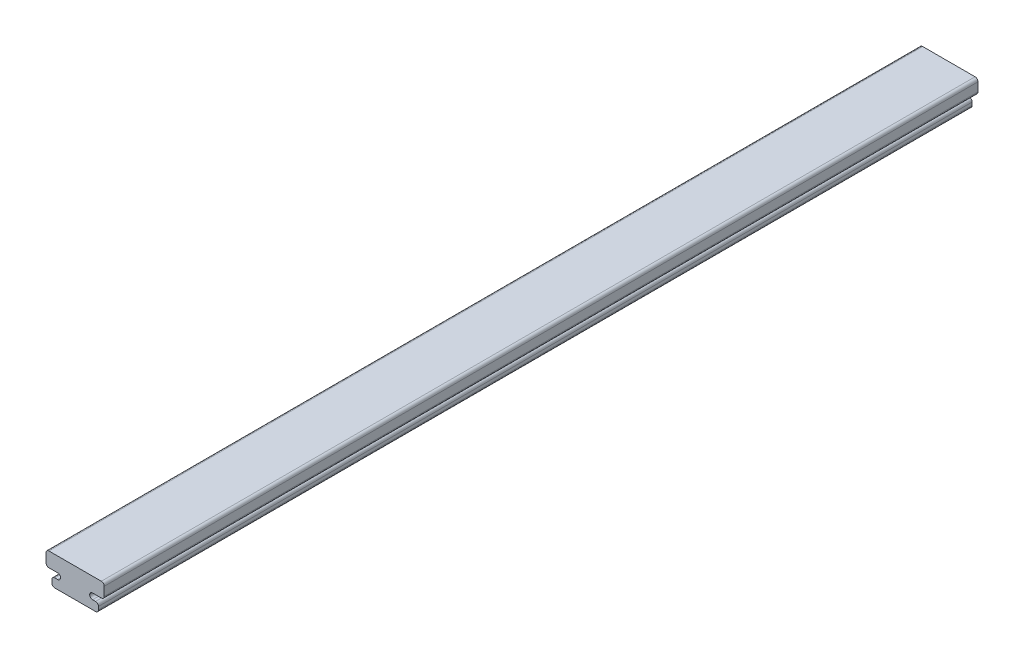
ISO-10303-21;
HEADER;
FILE_DESCRIPTION(('STEP AP214'),'2;1');
FILE_NAME('part.step','',(''),(''),'','','');
FILE_SCHEMA(('AUTOMOTIVE_DESIGN { 1 0 10303 214 1 1 1 1 }'));
ENDSEC;
DATA;
#1=APPLICATION_CONTEXT('core data for automotive mechanical design processes');
#2=APPLICATION_PROTOCOL_DEFINITION('international standard','automotive_design',2000,#1);
#3=PRODUCT_CONTEXT('',#1,'mechanical');
#4=PRODUCT('Part','Part','',(#3));
#5=PRODUCT_RELATED_PRODUCT_CATEGORY('part','',(#4));
#6=PRODUCT_DEFINITION_FORMATION('','',#4);
#7=PRODUCT_DEFINITION_CONTEXT('part definition',#1,'design');
#8=PRODUCT_DEFINITION('design','',#6,#7);
#9=PRODUCT_DEFINITION_SHAPE('','',#8);
#10=(LENGTH_UNIT() NAMED_UNIT(*) SI_UNIT(.MILLI.,.METRE.));
#11=(NAMED_UNIT(*) PLANE_ANGLE_UNIT() SI_UNIT($,.RADIAN.));
#12=(NAMED_UNIT(*) SI_UNIT($,.STERADIAN.) SOLID_ANGLE_UNIT());
#13=UNCERTAINTY_MEASURE_WITH_UNIT(LENGTH_MEASURE(1.E-05),#10,'distance_accuracy_value','');
#14=(GEOMETRIC_REPRESENTATION_CONTEXT(3) GLOBAL_UNCERTAINTY_ASSIGNED_CONTEXT((#13)) GLOBAL_UNIT_ASSIGNED_CONTEXT((#10,
#11,#12)) REPRESENTATION_CONTEXT('',''));
#15=CARTESIAN_POINT('',(0.,0.,0.));
#16=DIRECTION('',(0.,0.,1.));
#17=DIRECTION('',(1.,0.,0.));
#18=AXIS2_PLACEMENT_3D('',#15,#16,#17);
#19=CARTESIAN_POINT('',(0.,0.,300.));
#20=DIRECTION('',(-1.,0.,0.));
#21=DIRECTION('',(0.,0.,1.));
#22=AXIS2_PLACEMENT_3D('',#19,#20,#21);
#23=PLANE('',#22);
#24=DIRECTION('',(0.,1.,0.));
#25=VECTOR('',#24,1.);
#26=CARTESIAN_POINT('',(0.,0.,300.));
#27=LINE('',#26,#25);
#28=CARTESIAN_POINT('',(0.,1.,300.));
#29=VERTEX_POINT('',#28);
#30=CARTESIAN_POINT('',(0.,2.,300.));
#31=VERTEX_POINT('',#30);
#32=EDGE_CURVE('E225',#29,#31,#27,.T.);
#33=ORIENTED_EDGE('',*,*,#32,.F.);
#34=DIRECTION('',(0.,0.,-1.));
#35=VECTOR('',#34,1.);
#36=CARTESIAN_POINT('',(0.,1.,300.));
#37=LINE('',#36,#35);
#38=CARTESIAN_POINT('',(0.,1.,0.));
#39=VERTEX_POINT('',#38);
#40=EDGE_CURVE('E244',#29,#39,#37,.T.);
#41=ORIENTED_EDGE('',*,*,#40,.T.);
#42=DIRECTION('',(0.,1.,0.));
#43=VECTOR('',#42,1.);
#44=CARTESIAN_POINT('',(0.,0.,0.));
#45=LINE('',#44,#43);
#46=CARTESIAN_POINT('',(0.,2.,0.));
#47=VERTEX_POINT('',#46);
#48=EDGE_CURVE('E311',#39,#47,#45,.T.);
#49=ORIENTED_EDGE('',*,*,#48,.T.);
#50=DIRECTION('',(0.,0.,-1.));
#51=VECTOR('',#50,1.);
#52=CARTESIAN_POINT('',(0.,2.,300.));
#53=LINE('',#52,#51);
#54=EDGE_CURVE('E242',#47,#31,#53,.F.);
#55=ORIENTED_EDGE('',*,*,#54,.T.);
#56=EDGE_LOOP('',(#33,#41,#49,#55));
#57=FACE_BOUND('',#56,.T.);
#58=ADVANCED_FACE('F33',(#57),#23,.F.);
#59=CARTESIAN_POINT('',(0.,3.,300.));
#60=DIRECTION('',(0.,-1.,0.));
#61=DIRECTION('',(1.,0.,0.));
#62=AXIS2_PLACEMENT_3D('',#59,#60,#61);
#63=PLANE('',#62);
#64=DIRECTION('',(-1.,0.,0.));
#65=VECTOR('',#64,1.);
#66=CARTESIAN_POINT('',(0.,3.,0.));
#67=LINE('',#66,#65);
#68=CARTESIAN_POINT('',(-1.,3.,0.));
#69=VERTEX_POINT('',#68);
#70=CARTESIAN_POINT('',(-2.,3.,0.));
#71=VERTEX_POINT('',#70);
#72=EDGE_CURVE('E315',#69,#71,#67,.T.);
#73=ORIENTED_EDGE('',*,*,#72,.T.);
#74=DIRECTION('',(0.,0.,-1.));
#75=VECTOR('',#74,1.);
#76=CARTESIAN_POINT('',(-2.,3.,300.));
#77=LINE('',#76,#75);
#78=CARTESIAN_POINT('',(-2.,3.,300.));
#79=VERTEX_POINT('',#78);
#80=EDGE_CURVE('E240',#71,#79,#77,.F.);
#81=ORIENTED_EDGE('',*,*,#80,.T.);
#82=DIRECTION('',(-1.,0.,0.));
#83=VECTOR('',#82,1.);
#84=CARTESIAN_POINT('',(0.,3.,300.));
#85=LINE('',#84,#83);
#86=CARTESIAN_POINT('',(-1.,3.,300.));
#87=VERTEX_POINT('',#86);
#88=EDGE_CURVE('E386',#87,#79,#85,.T.);
#89=ORIENTED_EDGE('',*,*,#88,.F.);
#90=DIRECTION('',(0.,0.,-1.));
#91=VECTOR('',#90,1.);
#92=CARTESIAN_POINT('',(-1.,3.,300.));
#93=LINE('',#92,#91);
#94=EDGE_CURVE('E237',#87,#69,#93,.T.);
#95=ORIENTED_EDGE('',*,*,#94,.T.);
#96=EDGE_LOOP('',(#73,#81,#89,#95));
#97=FACE_BOUND('',#96,.T.);
#98=ADVANCED_FACE('F328',(#97),#63,.F.);
#99=CARTESIAN_POINT('',(2.,5.,300.));
#100=DIRECTION('',(0.,1.,0.));
#101=DIRECTION('',(0.,0.,1.));
#102=AXIS2_PLACEMENT_3D('',#99,#100,#101);
#103=PLANE('',#102);
#104=DIRECTION('',(1.,0.,0.));
#105=VECTOR('',#104,1.);
#106=CARTESIAN_POINT('',(2.,5.,300.));
#107=LINE('',#106,#105);
#108=CARTESIAN_POINT('',(-2.,5.,300.));
#109=VERTEX_POINT('',#108);
#110=CARTESIAN_POINT('',(1.,5.,300.));
#111=VERTEX_POINT('',#110);
#112=EDGE_CURVE('E388',#109,#111,#107,.T.);
#113=ORIENTED_EDGE('',*,*,#112,.F.);
#114=DIRECTION('',(0.,0.,-1.));
#115=VECTOR('',#114,1.);
#116=CARTESIAN_POINT('',(-2.,5.,0.));
#117=LINE('',#116,#115);
#118=CARTESIAN_POINT('',(-2.,5.,0.));
#119=VERTEX_POINT('',#118);
#120=EDGE_CURVE('E234',#109,#119,#117,.T.);
#121=ORIENTED_EDGE('',*,*,#120,.T.);
#122=DIRECTION('',(1.,0.,0.));
#123=VECTOR('',#122,1.);
#124=CARTESIAN_POINT('',(2.,5.,0.));
#125=LINE('',#124,#123);
#126=CARTESIAN_POINT('',(1.,5.,0.));
#127=VERTEX_POINT('',#126);
#128=EDGE_CURVE('E331',#119,#127,#125,.T.);
#129=ORIENTED_EDGE('',*,*,#128,.T.);
#130=DIRECTION('',(0.,0.,-1.));
#131=VECTOR('',#130,1.);
#132=CARTESIAN_POINT('',(1.,5.,300.));
#133=LINE('',#132,#131);
#134=EDGE_CURVE('E232',#127,#111,#133,.F.);
#135=ORIENTED_EDGE('',*,*,#134,.T.);
#136=EDGE_LOOP('',(#113,#121,#129,#135));
#137=FACE_BOUND('',#136,.T.);
#138=ADVANCED_FACE('F408',(#137),#103,.F.);
#139=CARTESIAN_POINT('',(2.,10.,300.));
#140=DIRECTION('',(-1.,0.,0.));
#141=DIRECTION('',(0.,0.,1.));
#142=AXIS2_PLACEMENT_3D('',#139,#140,#141);
#143=PLANE('',#142);
#144=DIRECTION('',(0.,1.,0.));
#145=VECTOR('',#144,1.);
#146=CARTESIAN_POINT('',(2.,10.,300.));
#147=LINE('',#146,#145);
#148=CARTESIAN_POINT('',(2.,6.,300.));
#149=VERTEX_POINT('',#148);
#150=CARTESIAN_POINT('',(2.,9.,300.));
#151=VERTEX_POINT('',#150);
#152=EDGE_CURVE('E361',#149,#151,#147,.T.);
#153=ORIENTED_EDGE('',*,*,#152,.F.);
#154=DIRECTION('',(0.,0.,-1.));
#155=VECTOR('',#154,1.);
#156=CARTESIAN_POINT('',(2.,6.,300.));
#157=LINE('',#156,#155);
#158=CARTESIAN_POINT('',(2.,6.,0.));
#159=VERTEX_POINT('',#158);
#160=EDGE_CURVE('E287',#149,#159,#157,.T.);
#161=ORIENTED_EDGE('',*,*,#160,.T.);
#162=DIRECTION('',(0.,1.,0.));
#163=VECTOR('',#162,1.);
#164=CARTESIAN_POINT('',(2.,10.,0.));
#165=LINE('',#164,#163);
#166=CARTESIAN_POINT('',(2.,9.,0.));
#167=VERTEX_POINT('',#166);
#168=EDGE_CURVE('E334',#159,#167,#165,.T.);
#169=ORIENTED_EDGE('',*,*,#168,.T.);
#170=DIRECTION('',(0.,0.,-1.));
#171=VECTOR('',#170,1.);
#172=CARTESIAN_POINT('',(2.,9.,300.));
#173=LINE('',#172,#171);
#174=EDGE_CURVE('E285',#167,#151,#173,.F.);
#175=ORIENTED_EDGE('',*,*,#174,.T.);
#176=EDGE_LOOP('',(#153,#161,#169,#175));
#177=FACE_BOUND('',#176,.T.);
#178=ADVANCED_FACE('F402',(#177),#143,.F.);
#179=CARTESIAN_POINT('',(2.,10.,300.));
#180=DIRECTION('',(0.,-1.,0.));
#181=DIRECTION('',(0.,0.,-1.));
#182=AXIS2_PLACEMENT_3D('',#179,#180,#181);
#183=PLANE('',#182);
#184=DIRECTION('',(-1.,0.,0.));
#185=VECTOR('',#184,1.);
#186=CARTESIAN_POINT('',(2.,10.,300.));
#187=LINE('',#186,#185);
#188=CARTESIAN_POINT('',(1.,10.,300.));
#189=VERTEX_POINT('',#188);
#190=CARTESIAN_POINT('',(-17.,10.,300.));
#191=VERTEX_POINT('',#190);
#192=EDGE_CURVE('E355',#189,#191,#187,.T.);
#193=ORIENTED_EDGE('',*,*,#192,.F.);
#194=DIRECTION('',(0.,0.,-1.));
#195=VECTOR('',#194,1.);
#196=CARTESIAN_POINT('',(1.,10.,300.));
#197=LINE('',#196,#195);
#198=CARTESIAN_POINT('',(1.,10.,0.));
#199=VERTEX_POINT('',#198);
#200=EDGE_CURVE('E296',#189,#199,#197,.T.);
#201=ORIENTED_EDGE('',*,*,#200,.T.);
#202=DIRECTION('',(-1.,0.,0.));
#203=VECTOR('',#202,1.);
#204=CARTESIAN_POINT('',(2.,10.,0.));
#205=LINE('',#204,#203);
#206=CARTESIAN_POINT('',(-17.,10.,0.));
#207=VERTEX_POINT('',#206);
#208=EDGE_CURVE('E217',#199,#207,#205,.T.);
#209=ORIENTED_EDGE('',*,*,#208,.T.);
#210=DIRECTION('',(0.,0.,-1.));
#211=VECTOR('',#210,1.);
#212=CARTESIAN_POINT('',(-17.,10.,300.));
#213=LINE('',#212,#211);
#214=EDGE_CURVE('E294',#207,#191,#213,.F.);
#215=ORIENTED_EDGE('',*,*,#214,.T.);
#216=EDGE_LOOP('',(#193,#201,#209,#215));
#217=FACE_BOUND('',#216,.T.);
#218=ADVANCED_FACE('F344',(#217),#183,.F.);
#219=CARTESIAN_POINT('',(-18.,10.,300.));
#220=DIRECTION('',(1.,0.,0.));
#221=DIRECTION('',(0.,0.,-1.));
#222=AXIS2_PLACEMENT_3D('',#219,#220,#221);
#223=PLANE('',#222);
#224=DIRECTION('',(0.,-1.,0.));
#225=VECTOR('',#224,1.);
#226=CARTESIAN_POINT('',(-18.,10.,0.));
#227=LINE('',#226,#225);
#228=CARTESIAN_POINT('',(-18.,9.,0.));
#229=VERTEX_POINT('',#228);
#230=CARTESIAN_POINT('',(-18.,6.,0.));
#231=VERTEX_POINT('',#230);
#232=EDGE_CURVE('E212',#229,#231,#227,.T.);
#233=ORIENTED_EDGE('',*,*,#232,.T.);
#234=DIRECTION('',(0.,0.,-1.));
#235=VECTOR('',#234,1.);
#236=CARTESIAN_POINT('',(-18.,6.,300.));
#237=LINE('',#236,#235);
#238=CARTESIAN_POINT('',(-18.,6.,300.));
#239=VERTEX_POINT('',#238);
#240=EDGE_CURVE('E188',#231,#239,#237,.F.);
#241=ORIENTED_EDGE('',*,*,#240,.T.);
#242=DIRECTION('',(0.,-1.,0.));
#243=VECTOR('',#242,1.);
#244=CARTESIAN_POINT('',(-18.,10.,300.));
#245=LINE('',#244,#243);
#246=CARTESIAN_POINT('',(-18.,9.,300.));
#247=VERTEX_POINT('',#246);
#248=EDGE_CURVE('E354',#247,#239,#245,.T.);
#249=ORIENTED_EDGE('',*,*,#248,.F.);
#250=DIRECTION('',(0.,0.,-1.));
#251=VECTOR('',#250,1.);
#252=CARTESIAN_POINT('',(-18.,9.,300.));
#253=LINE('',#252,#251);
#254=EDGE_CURVE('E290',#247,#229,#253,.T.);
#255=ORIENTED_EDGE('',*,*,#254,.T.);
#256=EDGE_LOOP('',(#233,#241,#249,#255));
#257=FACE_BOUND('',#256,.T.);
#258=ADVANCED_FACE('F357',(#257),#223,.F.);
#259=CARTESIAN_POINT('',(-18.,5.,300.));
#260=DIRECTION('',(0.,1.,0.));
#261=DIRECTION('',(0.,0.,1.));
#262=AXIS2_PLACEMENT_3D('',#259,#260,#261);
#263=PLANE('',#262);
#264=DIRECTION('',(1.,0.,0.));
#265=VECTOR('',#264,1.);
#266=CARTESIAN_POINT('',(-18.,5.,0.));
#267=LINE('',#266,#265);
#268=CARTESIAN_POINT('',(-17.,5.,0.));
#269=VERTEX_POINT('',#268);
#270=CARTESIAN_POINT('',(-14.,5.,0.));
#271=VERTEX_POINT('',#270);
#272=EDGE_CURVE('E200',#269,#271,#267,.T.);
#273=ORIENTED_EDGE('',*,*,#272,.T.);
#274=DIRECTION('',(0.,0.,-1.));
#275=VECTOR('',#274,1.);
#276=CARTESIAN_POINT('',(-14.,5.,300.));
#277=LINE('',#276,#275);
#278=CARTESIAN_POINT('',(-14.,5.,300.));
#279=VERTEX_POINT('',#278);
#280=EDGE_CURVE('E204',#271,#279,#277,.F.);
#281=ORIENTED_EDGE('',*,*,#280,.T.);
#282=DIRECTION('',(1.,0.,0.));
#283=VECTOR('',#282,1.);
#284=CARTESIAN_POINT('',(-18.,5.,300.));
#285=LINE('',#284,#283);
#286=CARTESIAN_POINT('',(-17.,5.,300.));
#287=VERTEX_POINT('',#286);
#288=EDGE_CURVE('E203',#287,#279,#285,.T.);
#289=ORIENTED_EDGE('',*,*,#288,.F.);
#290=DIRECTION('',(0.,0.,-1.));
#291=VECTOR('',#290,1.);
#292=CARTESIAN_POINT('',(-17.,5.,300.));
#293=LINE('',#292,#291);
#294=EDGE_CURVE('E187',#287,#269,#293,.T.);
#295=ORIENTED_EDGE('',*,*,#294,.T.);
#296=EDGE_LOOP('',(#273,#281,#289,#295));
#297=FACE_BOUND('',#296,.T.);
#298=ADVANCED_FACE('F198',(#297),#263,.F.);
#299=CARTESIAN_POINT('',(-16.,3.,300.));
#300=DIRECTION('',(0.,-1.,0.));
#301=DIRECTION('',(0.,0.,-1.));
#302=AXIS2_PLACEMENT_3D('',#299,#300,#301);
#303=PLANE('',#302);
#304=DIRECTION('',(-1.,0.,0.));
#305=VECTOR('',#304,1.);
#306=CARTESIAN_POINT('',(-16.,3.,300.));
#307=LINE('',#306,#305);
#308=CARTESIAN_POINT('',(-14.,3.,300.));
#309=VERTEX_POINT('',#308);
#310=CARTESIAN_POINT('',(-15.,3.,300.));
#311=VERTEX_POINT('',#310);
#312=EDGE_CURVE('E359',#309,#311,#307,.T.);
#313=ORIENTED_EDGE('',*,*,#312,.F.);
#314=DIRECTION('',(0.,0.,-1.));
#315=VECTOR('',#314,1.);
#316=CARTESIAN_POINT('',(-14.,3.,0.));
#317=LINE('',#316,#315);
#318=CARTESIAN_POINT('',(-14.,3.,0.));
#319=VERTEX_POINT('',#318);
#320=EDGE_CURVE('E230',#309,#319,#317,.T.);
#321=ORIENTED_EDGE('',*,*,#320,.T.);
#322=DIRECTION('',(-1.,0.,0.));
#323=VECTOR('',#322,1.);
#324=CARTESIAN_POINT('',(-16.,3.,0.));
#325=LINE('',#324,#323);
#326=CARTESIAN_POINT('',(-15.,3.,0.));
#327=VERTEX_POINT('',#326);
#328=EDGE_CURVE('E211',#319,#327,#325,.T.);
#329=ORIENTED_EDGE('',*,*,#328,.T.);
#330=DIRECTION('',(0.,0.,-1.));
#331=VECTOR('',#330,1.);
#332=CARTESIAN_POINT('',(-15.,3.,300.));
#333=LINE('',#332,#331);
#334=EDGE_CURVE('E228',#327,#311,#333,.F.);
#335=ORIENTED_EDGE('',*,*,#334,.T.);
#336=EDGE_LOOP('',(#313,#321,#329,#335));
#337=FACE_BOUND('',#336,.T.);
#338=ADVANCED_FACE('F546',(#337),#303,.F.);
#339=CARTESIAN_POINT('',(-16.,0.,300.));
#340=DIRECTION('',(1.,0.,0.));
#341=DIRECTION('',(0.,0.,-1.));
#342=AXIS2_PLACEMENT_3D('',#339,#340,#341);
#343=PLANE('',#342);
#344=DIRECTION('',(0.,-1.,0.));
#345=VECTOR('',#344,1.);
#346=CARTESIAN_POINT('',(-16.,0.,300.));
#347=LINE('',#346,#345);
#348=CARTESIAN_POINT('',(-16.,2.,300.));
#349=VERTEX_POINT('',#348);
#350=CARTESIAN_POINT('',(-16.,1.,300.));
#351=VERTEX_POINT('',#350);
#352=EDGE_CURVE('E367',#349,#351,#347,.T.);
#353=ORIENTED_EDGE('',*,*,#352,.F.);
#354=DIRECTION('',(0.,0.,-1.));
#355=VECTOR('',#354,1.);
#356=CARTESIAN_POINT('',(-16.,2.,300.));
#357=LINE('',#356,#355);
#358=CARTESIAN_POINT('',(-16.,2.,0.));
#359=VERTEX_POINT('',#358);
#360=EDGE_CURVE('E282',#349,#359,#357,.T.);
#361=ORIENTED_EDGE('',*,*,#360,.T.);
#362=DIRECTION('',(0.,-1.,0.));
#363=VECTOR('',#362,1.);
#364=CARTESIAN_POINT('',(-16.,0.,0.));
#365=LINE('',#364,#363);
#366=CARTESIAN_POINT('',(-16.,1.,0.));
#367=VERTEX_POINT('',#366);
#368=EDGE_CURVE('E215',#359,#367,#365,.T.);
#369=ORIENTED_EDGE('',*,*,#368,.T.);
#370=DIRECTION('',(0.,0.,-1.));
#371=VECTOR('',#370,1.);
#372=CARTESIAN_POINT('',(-16.,1.,300.));
#373=LINE('',#372,#371);
#374=EDGE_CURVE('E280',#367,#351,#373,.F.);
#375=ORIENTED_EDGE('',*,*,#374,.T.);
#376=EDGE_LOOP('',(#353,#361,#369,#375));
#377=FACE_BOUND('',#376,.T.);
#378=ADVANCED_FACE('F539',(#377),#343,.F.);
#379=CARTESIAN_POINT('',(0.,0.,300.));
#380=DIRECTION('',(0.,1.,0.));
#381=DIRECTION('',(0.,0.,1.));
#382=AXIS2_PLACEMENT_3D('',#379,#380,#381);
#383=PLANE('',#382);
#384=DIRECTION('',(1.,0.,0.));
#385=VECTOR('',#384,1.);
#386=CARTESIAN_POINT('',(0.,0.,0.));
#387=LINE('',#386,#385);
#388=CARTESIAN_POINT('',(-15.,0.,0.));
#389=VERTEX_POINT('',#388);
#390=CARTESIAN_POINT('',(-1.,0.,0.));
#391=VERTEX_POINT('',#390);
#392=EDGE_CURVE('E223',#389,#391,#387,.T.);
#393=ORIENTED_EDGE('',*,*,#392,.T.);
#394=DIRECTION('',(0.,0.,-1.));
#395=VECTOR('',#394,1.);
#396=CARTESIAN_POINT('',(-1.,0.,300.));
#397=LINE('',#396,#395);
#398=CARTESIAN_POINT('',(-1.,0.,300.));
#399=VERTEX_POINT('',#398);
#400=EDGE_CURVE('E262',#391,#399,#397,.F.);
#401=ORIENTED_EDGE('',*,*,#400,.T.);
#402=DIRECTION('',(1.,0.,0.));
#403=VECTOR('',#402,1.);
#404=CARTESIAN_POINT('',(0.,0.,300.));
#405=LINE('',#404,#403);
#406=CARTESIAN_POINT('',(-15.,0.,300.));
#407=VERTEX_POINT('',#406);
#408=EDGE_CURVE('E205',#407,#399,#405,.T.);
#409=ORIENTED_EDGE('',*,*,#408,.F.);
#410=DIRECTION('',(0.,0.,-1.));
#411=VECTOR('',#410,1.);
#412=CARTESIAN_POINT('',(-15.,0.,300.));
#413=LINE('',#412,#411);
#414=EDGE_CURVE('E259',#407,#389,#413,.T.);
#415=ORIENTED_EDGE('',*,*,#414,.T.);
#416=EDGE_LOOP('',(#393,#401,#409,#415));
#417=FACE_BOUND('',#416,.T.);
#418=ADVANCED_FACE('F532',(#417),#383,.F.);
#419=CARTESIAN_POINT('',(0.,0.,300.));
#420=DIRECTION('',(0.,0.,1.));
#421=DIRECTION('',(1.,0.,0.));
#422=AXIS2_PLACEMENT_3D('',#419,#420,#421);
#423=PLANE('',#422);
#424=ORIENTED_EDGE('',*,*,#408,.T.);
#425=CARTESIAN_POINT('',(-1.,1.,300.));
#426=DIRECTION('',(0.,0.,1.));
#427=DIRECTION('',(1.,0.,0.));
#428=AXIS2_PLACEMENT_3D('',#425,#426,#427);
#429=CIRCLE('',#428,1.);
#430=EDGE_CURVE('E278',#399,#29,#429,.T.);
#431=ORIENTED_EDGE('',*,*,#430,.T.);
#432=ORIENTED_EDGE('',*,*,#32,.T.);
#433=CARTESIAN_POINT('',(-1.,2.,300.));
#434=DIRECTION('',(0.,0.,1.));
#435=DIRECTION('',(1.,0.,0.));
#436=AXIS2_PLACEMENT_3D('',#433,#434,#435);
#437=CIRCLE('',#436,1.);
#438=EDGE_CURVE('E276',#31,#87,#437,.T.);
#439=ORIENTED_EDGE('',*,*,#438,.T.);
#440=ORIENTED_EDGE('',*,*,#88,.T.);
#441=CARTESIAN_POINT('',(-2.,4.,300.));
#442=DIRECTION('',(0.,0.,1.));
#443=DIRECTION('',(1.,0.,0.));
#444=AXIS2_PLACEMENT_3D('',#441,#442,#443);
#445=CIRCLE('',#444,1.);
#446=CARTESIAN_POINT('',(-3.,4.,300.));
#447=VERTEX_POINT('',#446);
#448=EDGE_CURVE('E11',#79,#447,#445,.F.);
#449=ORIENTED_EDGE('',*,*,#448,.T.);
#450=CARTESIAN_POINT('',(-2.,4.,300.));
#451=DIRECTION('',(0.,0.,1.));
#452=DIRECTION('',(1.,0.,0.));
#453=AXIS2_PLACEMENT_3D('',#450,#451,#452);
#454=CIRCLE('',#453,1.);
#455=EDGE_CURVE('E307',#447,#109,#454,.F.);
#456=ORIENTED_EDGE('',*,*,#455,.T.);
#457=ORIENTED_EDGE('',*,*,#112,.T.);
#458=CARTESIAN_POINT('',(1.,6.,300.));
#459=DIRECTION('',(0.,0.,1.));
#460=DIRECTION('',(1.,0.,0.));
#461=AXIS2_PLACEMENT_3D('',#458,#459,#460);
#462=CIRCLE('',#461,1.);
#463=EDGE_CURVE('E270',#111,#149,#462,.T.);
#464=ORIENTED_EDGE('',*,*,#463,.T.);
#465=ORIENTED_EDGE('',*,*,#152,.T.);
#466=CARTESIAN_POINT('',(1.,9.,300.));
#467=DIRECTION('',(0.,0.,1.));
#468=DIRECTION('',(1.,0.,0.));
#469=AXIS2_PLACEMENT_3D('',#466,#467,#468);
#470=CIRCLE('',#469,1.);
#471=EDGE_CURVE('E266',#151,#189,#470,.T.);
#472=ORIENTED_EDGE('',*,*,#471,.T.);
#473=ORIENTED_EDGE('',*,*,#192,.T.);
#474=CARTESIAN_POINT('',(-17.,9.,300.));
#475=DIRECTION('',(0.,0.,1.));
#476=DIRECTION('',(1.,0.,0.));
#477=AXIS2_PLACEMENT_3D('',#474,#475,#476);
#478=CIRCLE('',#477,1.);
#479=EDGE_CURVE('E264',#191,#247,#478,.T.);
#480=ORIENTED_EDGE('',*,*,#479,.T.);
#481=ORIENTED_EDGE('',*,*,#248,.T.);
#482=CARTESIAN_POINT('',(-17.,6.,300.));
#483=DIRECTION('',(0.,0.,1.));
#484=DIRECTION('',(1.,0.,0.));
#485=AXIS2_PLACEMENT_3D('',#482,#483,#484);
#486=CIRCLE('',#485,1.);
#487=EDGE_CURVE('E268',#239,#287,#486,.T.);
#488=ORIENTED_EDGE('',*,*,#487,.T.);
#489=ORIENTED_EDGE('',*,*,#288,.T.);
#490=CARTESIAN_POINT('',(-14.,4.,300.));
#491=DIRECTION('',(0.,0.,1.));
#492=DIRECTION('',(1.,0.,0.));
#493=AXIS2_PLACEMENT_3D('',#490,#491,#492);
#494=CIRCLE('',#493,1.);
#495=CARTESIAN_POINT('',(-13.,4.,300.));
#496=VERTEX_POINT('',#495);
#497=EDGE_CURVE('E300',#279,#496,#494,.F.);
#498=ORIENTED_EDGE('',*,*,#497,.T.);
#499=CARTESIAN_POINT('',(-14.,4.,300.));
#500=DIRECTION('',(0.,0.,1.));
#501=DIRECTION('',(1.,0.,0.));
#502=AXIS2_PLACEMENT_3D('',#499,#500,#501);
#503=CIRCLE('',#502,1.);
#504=EDGE_CURVE('E304',#496,#309,#503,.F.);
#505=ORIENTED_EDGE('',*,*,#504,.T.);
#506=ORIENTED_EDGE('',*,*,#312,.T.);
#507=CARTESIAN_POINT('',(-15.,2.,300.));
#508=DIRECTION('',(0.,0.,1.));
#509=DIRECTION('',(1.,0.,0.));
#510=AXIS2_PLACEMENT_3D('',#507,#508,#509);
#511=CIRCLE('',#510,1.);
#512=EDGE_CURVE('E274',#311,#349,#511,.T.);
#513=ORIENTED_EDGE('',*,*,#512,.T.);
#514=ORIENTED_EDGE('',*,*,#352,.T.);
#515=CARTESIAN_POINT('',(-15.,1.,300.));
#516=DIRECTION('',(0.,0.,1.));
#517=DIRECTION('',(1.,0.,0.));
#518=AXIS2_PLACEMENT_3D('',#515,#516,#517);
#519=CIRCLE('',#518,1.);
#520=EDGE_CURVE('E272',#351,#407,#519,.T.);
#521=ORIENTED_EDGE('',*,*,#520,.T.);
#522=EDGE_LOOP('',(#424,#431,#432,#439,#440,#449,#456,#457,#464,#465,#472,#473,#480,#481,#488,
#489,#498,#505,#506,#513,#514,#521));
#523=FACE_BOUND('',#522,.T.);
#524=ADVANCED_FACE('F353',(#523),#423,.T.);
#525=CARTESIAN_POINT('',(0.,0.,0.));
#526=DIRECTION('',(0.,0.,1.));
#527=DIRECTION('',(1.,0.,0.));
#528=AXIS2_PLACEMENT_3D('',#525,#526,#527);
#529=PLANE('',#528);
#530=ORIENTED_EDGE('',*,*,#48,.F.);
#531=CARTESIAN_POINT('',(-1.,1.,0.));
#532=DIRECTION('',(0.,0.,1.));
#533=DIRECTION('',(1.,0.,0.));
#534=AXIS2_PLACEMENT_3D('',#531,#532,#533);
#535=CIRCLE('',#534,1.);
#536=EDGE_CURVE('E257',#39,#391,#535,.F.);
#537=ORIENTED_EDGE('',*,*,#536,.T.);
#538=ORIENTED_EDGE('',*,*,#392,.F.);
#539=CARTESIAN_POINT('',(-15.,1.,0.));
#540=DIRECTION('',(0.,0.,1.));
#541=DIRECTION('',(1.,0.,0.));
#542=AXIS2_PLACEMENT_3D('',#539,#540,#541);
#543=CIRCLE('',#542,1.);
#544=EDGE_CURVE('E251',#389,#367,#543,.F.);
#545=ORIENTED_EDGE('',*,*,#544,.T.);
#546=ORIENTED_EDGE('',*,*,#368,.F.);
#547=CARTESIAN_POINT('',(-15.,2.,0.));
#548=DIRECTION('',(0.,0.,1.));
#549=DIRECTION('',(1.,0.,0.));
#550=AXIS2_PLACEMENT_3D('',#547,#548,#549);
#551=CIRCLE('',#550,1.);
#552=EDGE_CURVE('E253',#359,#327,#551,.F.);
#553=ORIENTED_EDGE('',*,*,#552,.T.);
#554=ORIENTED_EDGE('',*,*,#328,.F.);
#555=CARTESIAN_POINT('',(-14.,4.,0.));
#556=DIRECTION('',(0.,0.,1.));
#557=DIRECTION('',(1.,0.,0.));
#558=AXIS2_PLACEMENT_3D('',#555,#556,#557);
#559=CIRCLE('',#558,1.);
#560=CARTESIAN_POINT('',(-13.,4.,0.));
#561=VERTEX_POINT('',#560);
#562=EDGE_CURVE('E302',#319,#561,#559,.T.);
#563=ORIENTED_EDGE('',*,*,#562,.T.);
#564=CARTESIAN_POINT('',(-14.,4.,0.));
#565=DIRECTION('',(0.,0.,1.));
#566=DIRECTION('',(1.,0.,0.));
#567=AXIS2_PLACEMENT_3D('',#564,#565,#566);
#568=CIRCLE('',#567,1.);
#569=EDGE_CURVE('E210',#561,#271,#568,.T.);
#570=ORIENTED_EDGE('',*,*,#569,.T.);
#571=ORIENTED_EDGE('',*,*,#272,.F.);
#572=CARTESIAN_POINT('',(-17.,6.,0.));
#573=DIRECTION('',(0.,0.,1.));
#574=DIRECTION('',(1.,0.,0.));
#575=AXIS2_PLACEMENT_3D('',#572,#573,#574);
#576=CIRCLE('',#575,1.);
#577=EDGE_CURVE('E183',#269,#231,#576,.F.);
#578=ORIENTED_EDGE('',*,*,#577,.T.);
#579=ORIENTED_EDGE('',*,*,#232,.F.);
#580=CARTESIAN_POINT('',(-17.,9.,0.));
#581=DIRECTION('',(0.,0.,1.));
#582=DIRECTION('',(1.,0.,0.));
#583=AXIS2_PLACEMENT_3D('',#580,#581,#582);
#584=CIRCLE('',#583,1.);
#585=EDGE_CURVE('E247',#229,#207,#584,.F.);
#586=ORIENTED_EDGE('',*,*,#585,.T.);
#587=ORIENTED_EDGE('',*,*,#208,.F.);
#588=CARTESIAN_POINT('',(1.,9.,0.));
#589=DIRECTION('',(0.,0.,1.));
#590=DIRECTION('',(1.,0.,0.));
#591=AXIS2_PLACEMENT_3D('',#588,#589,#590);
#592=CIRCLE('',#591,1.);
#593=EDGE_CURVE('E193',#199,#167,#592,.F.);
#594=ORIENTED_EDGE('',*,*,#593,.T.);
#595=ORIENTED_EDGE('',*,*,#168,.F.);
#596=CARTESIAN_POINT('',(1.,6.,0.));
#597=DIRECTION('',(0.,0.,1.));
#598=DIRECTION('',(1.,0.,0.));
#599=AXIS2_PLACEMENT_3D('',#596,#597,#598);
#600=CIRCLE('',#599,1.);
#601=EDGE_CURVE('E192',#159,#127,#600,.F.);
#602=ORIENTED_EDGE('',*,*,#601,.T.);
#603=ORIENTED_EDGE('',*,*,#128,.F.);
#604=CARTESIAN_POINT('',(-2.,4.,0.));
#605=DIRECTION('',(0.,0.,1.));
#606=DIRECTION('',(1.,0.,0.));
#607=AXIS2_PLACEMENT_3D('',#604,#605,#606);
#608=CIRCLE('',#607,1.);
#609=CARTESIAN_POINT('',(-3.,4.,0.));
#610=VERTEX_POINT('',#609);
#611=EDGE_CURVE('E56',#119,#610,#608,.T.);
#612=ORIENTED_EDGE('',*,*,#611,.T.);
#613=CARTESIAN_POINT('',(-2.,4.,0.));
#614=DIRECTION('',(0.,0.,1.));
#615=DIRECTION('',(1.,0.,0.));
#616=AXIS2_PLACEMENT_3D('',#613,#614,#615);
#617=CIRCLE('',#616,1.);
#618=EDGE_CURVE('E42',#610,#71,#617,.T.);
#619=ORIENTED_EDGE('',*,*,#618,.T.);
#620=ORIENTED_EDGE('',*,*,#72,.F.);
#621=CARTESIAN_POINT('',(-1.,2.,0.));
#622=DIRECTION('',(0.,0.,1.));
#623=DIRECTION('',(1.,0.,0.));
#624=AXIS2_PLACEMENT_3D('',#621,#622,#623);
#625=CIRCLE('',#624,1.);
#626=EDGE_CURVE('E255',#69,#47,#625,.F.);
#627=ORIENTED_EDGE('',*,*,#626,.T.);
#628=EDGE_LOOP('',(#530,#537,#538,#545,#546,#553,#554,#563,#570,#571,#578,#579,#586,#587,#594,
#595,#602,#603,#612,#619,#620,#627));
#629=FACE_BOUND('',#628,.T.);
#630=ADVANCED_FACE('F208',(#629),#529,.F.);
#631=CARTESIAN_POINT('',(-14.,4.,300.));
#632=DIRECTION('',(0.,0.,1.));
#633=DIRECTION('',(1.,0.,0.));
#634=AXIS2_PLACEMENT_3D('',#631,#632,#633);
#635=CYLINDRICAL_SURFACE('',#634,1.);
#636=ORIENTED_EDGE('',*,*,#320,.F.);
#637=ORIENTED_EDGE('',*,*,#504,.F.);
#638=DIRECTION('',(0.,0.,-1.));
#639=VECTOR('',#638,1.);
#640=CARTESIAN_POINT('',(-13.,4.,300.));
#641=LINE('',#640,#639);
#642=EDGE_CURVE('E309',#561,#496,#641,.F.);
#643=ORIENTED_EDGE('',*,*,#642,.F.);
#644=ORIENTED_EDGE('',*,*,#562,.F.);
#645=EDGE_LOOP('',(#636,#637,#643,#644));
#646=FACE_BOUND('',#645,.T.);
#647=ADVANCED_FACE('F425',(#646),#635,.F.);
#648=CARTESIAN_POINT('',(-14.,4.,300.));
#649=DIRECTION('',(0.,0.,1.));
#650=DIRECTION('',(1.,0.,0.));
#651=AXIS2_PLACEMENT_3D('',#648,#649,#650);
#652=CYLINDRICAL_SURFACE('',#651,1.);
#653=ORIENTED_EDGE('',*,*,#497,.F.);
#654=ORIENTED_EDGE('',*,*,#280,.F.);
#655=ORIENTED_EDGE('',*,*,#569,.F.);
#656=ORIENTED_EDGE('',*,*,#642,.T.);
#657=EDGE_LOOP('',(#653,#654,#655,#656));
#658=FACE_BOUND('',#657,.T.);
#659=ADVANCED_FACE('F422',(#658),#652,.F.);
#660=CARTESIAN_POINT('',(-2.,4.,300.));
#661=DIRECTION('',(0.,0.,1.));
#662=DIRECTION('',(1.,0.,0.));
#663=AXIS2_PLACEMENT_3D('',#660,#661,#662);
#664=CYLINDRICAL_SURFACE('',#663,1.);
#665=DIRECTION('',(0.,0.,-1.));
#666=VECTOR('',#665,1.);
#667=CARTESIAN_POINT('',(-3.,4.,0.));
#668=LINE('',#667,#666);
#669=EDGE_CURVE('E37',#447,#610,#668,.T.);
#670=ORIENTED_EDGE('',*,*,#669,.F.);
#671=ORIENTED_EDGE('',*,*,#448,.F.);
#672=ORIENTED_EDGE('',*,*,#80,.F.);
#673=ORIENTED_EDGE('',*,*,#618,.F.);
#674=EDGE_LOOP('',(#670,#671,#672,#673));
#675=FACE_BOUND('',#674,.T.);
#676=ADVANCED_FACE('F323',(#675),#664,.F.);
#677=CARTESIAN_POINT('',(-2.,4.,300.));
#678=DIRECTION('',(0.,0.,1.));
#679=DIRECTION('',(1.,0.,0.));
#680=AXIS2_PLACEMENT_3D('',#677,#678,#679);
#681=CYLINDRICAL_SURFACE('',#680,1.);
#682=ORIENTED_EDGE('',*,*,#455,.F.);
#683=ORIENTED_EDGE('',*,*,#669,.T.);
#684=ORIENTED_EDGE('',*,*,#611,.F.);
#685=ORIENTED_EDGE('',*,*,#120,.F.);
#686=EDGE_LOOP('',(#682,#683,#684,#685));
#687=FACE_BOUND('',#686,.T.);
#688=ADVANCED_FACE('F320',(#687),#681,.F.);
#689=CARTESIAN_POINT('',(-1.,1.,300.));
#690=DIRECTION('',(0.,0.,-1.));
#691=DIRECTION('',(-1.,0.,0.));
#692=AXIS2_PLACEMENT_3D('',#689,#690,#691);
#693=CYLINDRICAL_SURFACE('',#692,1.);
#694=ORIENTED_EDGE('',*,*,#430,.F.);
#695=ORIENTED_EDGE('',*,*,#400,.F.);
#696=ORIENTED_EDGE('',*,*,#536,.F.);
#697=ORIENTED_EDGE('',*,*,#40,.F.);
#698=EDGE_LOOP('',(#694,#695,#696,#697));
#699=FACE_BOUND('',#698,.T.);
#700=ADVANCED_FACE('F379',(#699),#693,.T.);
#701=CARTESIAN_POINT('',(-1.,2.,300.));
#702=DIRECTION('',(0.,0.,-1.));
#703=DIRECTION('',(-1.,0.,0.));
#704=AXIS2_PLACEMENT_3D('',#701,#702,#703);
#705=CYLINDRICAL_SURFACE('',#704,1.);
#706=ORIENTED_EDGE('',*,*,#438,.F.);
#707=ORIENTED_EDGE('',*,*,#54,.F.);
#708=ORIENTED_EDGE('',*,*,#626,.F.);
#709=ORIENTED_EDGE('',*,*,#94,.F.);
#710=EDGE_LOOP('',(#706,#707,#708,#709));
#711=FACE_BOUND('',#710,.T.);
#712=ADVANCED_FACE('F385',(#711),#705,.T.);
#713=CARTESIAN_POINT('',(-15.,2.,300.));
#714=DIRECTION('',(0.,0.,-1.));
#715=DIRECTION('',(-1.,0.,0.));
#716=AXIS2_PLACEMENT_3D('',#713,#714,#715);
#717=CYLINDRICAL_SURFACE('',#716,1.);
#718=ORIENTED_EDGE('',*,*,#512,.F.);
#719=ORIENTED_EDGE('',*,*,#334,.F.);
#720=ORIENTED_EDGE('',*,*,#552,.F.);
#721=ORIENTED_EDGE('',*,*,#360,.F.);
#722=EDGE_LOOP('',(#718,#719,#720,#721));
#723=FACE_BOUND('',#722,.T.);
#724=ADVANCED_FACE('F437',(#723),#717,.T.);
#725=CARTESIAN_POINT('',(-15.,1.,300.));
#726=DIRECTION('',(0.,0.,-1.));
#727=DIRECTION('',(-1.,0.,0.));
#728=AXIS2_PLACEMENT_3D('',#725,#726,#727);
#729=CYLINDRICAL_SURFACE('',#728,1.);
#730=ORIENTED_EDGE('',*,*,#520,.F.);
#731=ORIENTED_EDGE('',*,*,#374,.F.);
#732=ORIENTED_EDGE('',*,*,#544,.F.);
#733=ORIENTED_EDGE('',*,*,#414,.F.);
#734=EDGE_LOOP('',(#730,#731,#732,#733));
#735=FACE_BOUND('',#734,.T.);
#736=ADVANCED_FACE('F440',(#735),#729,.T.);
#737=CARTESIAN_POINT('',(1.,6.,300.));
#738=DIRECTION('',(0.,0.,-1.));
#739=DIRECTION('',(-1.,0.,0.));
#740=AXIS2_PLACEMENT_3D('',#737,#738,#739);
#741=CYLINDRICAL_SURFACE('',#740,1.);
#742=ORIENTED_EDGE('',*,*,#463,.F.);
#743=ORIENTED_EDGE('',*,*,#134,.F.);
#744=ORIENTED_EDGE('',*,*,#601,.F.);
#745=ORIENTED_EDGE('',*,*,#160,.F.);
#746=EDGE_LOOP('',(#742,#743,#744,#745));
#747=FACE_BOUND('',#746,.T.);
#748=ADVANCED_FACE('F404',(#747),#741,.T.);
#749=CARTESIAN_POINT('',(-17.,6.,300.));
#750=DIRECTION('',(0.,0.,-1.));
#751=DIRECTION('',(-1.,0.,0.));
#752=AXIS2_PLACEMENT_3D('',#749,#750,#751);
#753=CYLINDRICAL_SURFACE('',#752,1.);
#754=ORIENTED_EDGE('',*,*,#487,.F.);
#755=ORIENTED_EDGE('',*,*,#240,.F.);
#756=ORIENTED_EDGE('',*,*,#577,.F.);
#757=ORIENTED_EDGE('',*,*,#294,.F.);
#758=EDGE_LOOP('',(#754,#755,#756,#757));
#759=FACE_BOUND('',#758,.T.);
#760=ADVANCED_FACE('F186',(#759),#753,.T.);
#761=CARTESIAN_POINT('',(1.,9.,300.));
#762=DIRECTION('',(0.,0.,-1.));
#763=DIRECTION('',(-1.,0.,0.));
#764=AXIS2_PLACEMENT_3D('',#761,#762,#763);
#765=CYLINDRICAL_SURFACE('',#764,1.);
#766=ORIENTED_EDGE('',*,*,#471,.F.);
#767=ORIENTED_EDGE('',*,*,#174,.F.);
#768=ORIENTED_EDGE('',*,*,#593,.F.);
#769=ORIENTED_EDGE('',*,*,#200,.F.);
#770=EDGE_LOOP('',(#766,#767,#768,#769));
#771=FACE_BOUND('',#770,.T.);
#772=ADVANCED_FACE('F400',(#771),#765,.T.);
#773=CARTESIAN_POINT('',(-17.,9.,300.));
#774=DIRECTION('',(0.,0.,-1.));
#775=DIRECTION('',(-1.,0.,0.));
#776=AXIS2_PLACEMENT_3D('',#773,#774,#775);
#777=CYLINDRICAL_SURFACE('',#776,1.);
#778=ORIENTED_EDGE('',*,*,#479,.F.);
#779=ORIENTED_EDGE('',*,*,#214,.F.);
#780=ORIENTED_EDGE('',*,*,#585,.F.);
#781=ORIENTED_EDGE('',*,*,#254,.F.);
#782=EDGE_LOOP('',(#778,#779,#780,#781));
#783=FACE_BOUND('',#782,.T.);
#784=ADVANCED_FACE('F35',(#783),#777,.T.);
#785=CLOSED_SHELL('',(#58,#98,#138,#178,#218,#258,#298,#338,#378,#418,#524,#630,#647,#659,#676,
#688,#700,#712,#724,#736,#748,#760,#772,#784));
#786=MANIFOLD_SOLID_BREP('B2',#785);
#787=ADVANCED_BREP_SHAPE_REPRESENTATION('',(#18,#786),#14);
#788=SHAPE_DEFINITION_REPRESENTATION(#9,#787);
ENDSEC;
END-ISO-10303-21;
